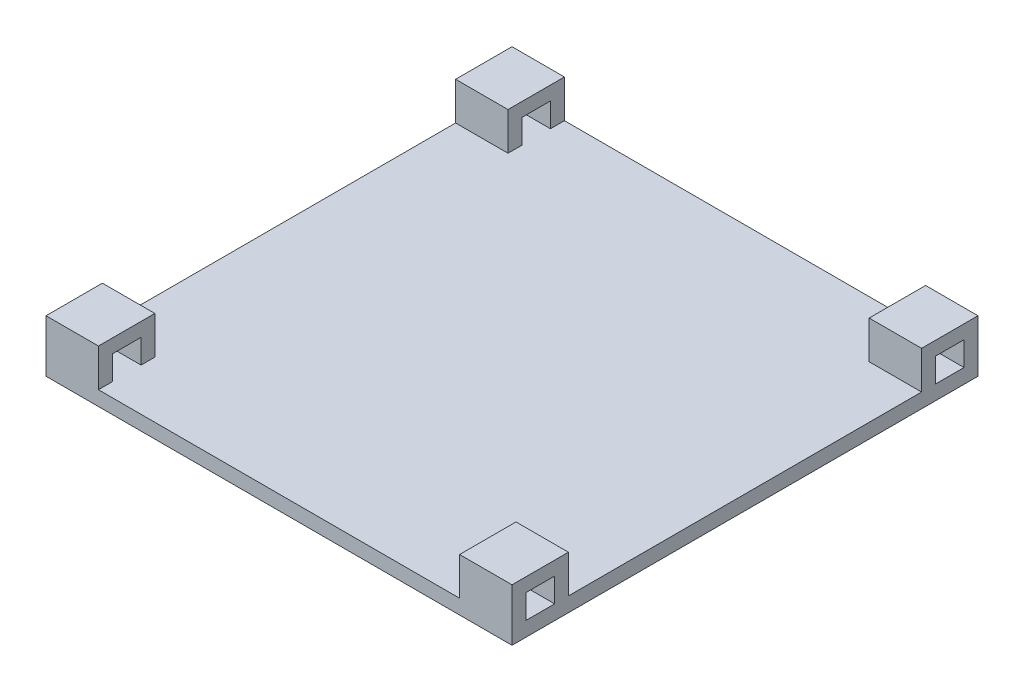
ISO-10303-21;
HEADER;
FILE_DESCRIPTION(('STEP AP214'),'2;1');
FILE_NAME('part.step','',(''),(''),'','','');
FILE_SCHEMA(('AUTOMOTIVE_DESIGN { 1 0 10303 214 1 1 1 1 }'));
ENDSEC;
DATA;
#1=APPLICATION_CONTEXT('core data for automotive mechanical design processes');
#2=APPLICATION_PROTOCOL_DEFINITION('international standard','automotive_design',2000,#1);
#3=PRODUCT_CONTEXT('',#1,'mechanical');
#4=PRODUCT('Part','Part','',(#3));
#5=PRODUCT_RELATED_PRODUCT_CATEGORY('part','',(#4));
#6=PRODUCT_DEFINITION_FORMATION('','',#4);
#7=PRODUCT_DEFINITION_CONTEXT('part definition',#1,'design');
#8=PRODUCT_DEFINITION('design','',#6,#7);
#9=PRODUCT_DEFINITION_SHAPE('','',#8);
#10=(LENGTH_UNIT() NAMED_UNIT(*) SI_UNIT(.MILLI.,.METRE.));
#11=(NAMED_UNIT(*) PLANE_ANGLE_UNIT() SI_UNIT($,.RADIAN.));
#12=(NAMED_UNIT(*) SI_UNIT($,.STERADIAN.) SOLID_ANGLE_UNIT());
#13=UNCERTAINTY_MEASURE_WITH_UNIT(LENGTH_MEASURE(1.E-05),#10,'distance_accuracy_value','');
#14=(GEOMETRIC_REPRESENTATION_CONTEXT(3) GLOBAL_UNCERTAINTY_ASSIGNED_CONTEXT((#13)) GLOBAL_UNIT_ASSIGNED_CONTEXT((#10,
#11,#12)) REPRESENTATION_CONTEXT('',''));
#15=CARTESIAN_POINT('',(0.,0.,0.));
#16=DIRECTION('',(0.,0.,1.));
#17=DIRECTION('',(1.,0.,0.));
#18=AXIS2_PLACEMENT_3D('',#15,#16,#17);
#19=CARTESIAN_POINT('',(0.,6.35,0.));
#20=DIRECTION('',(0.,-1.,0.));
#21=DIRECTION('',(0.,0.,-1.));
#22=AXIS2_PLACEMENT_3D('',#19,#20,#21);
#23=PLANE('',#22);
#24=DIRECTION('',(0.,0.,-1.));
#25=VECTOR('',#24,1.);
#26=CARTESIAN_POINT('',(22.86,6.35,0.));
#27=LINE('',#26,#25);
#28=CARTESIAN_POINT('',(22.86,6.35,6.09600000000005));
#29=VERTEX_POINT('',#28);
#30=CARTESIAN_POINT('',(22.86,6.35,0.));
#31=VERTEX_POINT('',#30);
#32=EDGE_CURVE('E374',#29,#31,#27,.T.);
#33=ORIENTED_EDGE('',*,*,#32,.F.);
#34=DIRECTION('',(1.,0.,0.));
#35=VECTOR('',#34,1.);
#36=CARTESIAN_POINT('',(-16.336098922326,6.35,6.09600000000005));
#37=LINE('',#36,#35);
#38=CARTESIAN_POINT('',(0.,6.35,6.09600000000005));
#39=VERTEX_POINT('',#38);
#40=EDGE_CURVE('E316',#39,#29,#37,.T.);
#41=ORIENTED_EDGE('',*,*,#40,.F.);
#42=DIRECTION('',(0.,0.,1.));
#43=VECTOR('',#42,1.);
#44=CARTESIAN_POINT('',(0.,6.35,6.09600000000004));
#45=LINE('',#44,#43);
#46=CARTESIAN_POINT('',(0.,6.35,18.6040000000001));
#47=VERTEX_POINT('',#46);
#48=EDGE_CURVE('E292',#39,#47,#45,.T.);
#49=ORIENTED_EDGE('',*,*,#48,.T.);
#50=DIRECTION('',(1.,0.,0.));
#51=VECTOR('',#50,1.);
#52=CARTESIAN_POINT('',(-16.3360989223259,6.35,18.6040000000001));
#53=LINE('',#52,#51);
#54=CARTESIAN_POINT('',(22.86,6.35,18.6040000000001));
#55=VERTEX_POINT('',#54);
#56=EDGE_CURVE('E290',#47,#55,#53,.T.);
#57=ORIENTED_EDGE('',*,*,#56,.T.);
#58=CARTESIAN_POINT('',(22.86,6.35,24.6000000000001));
#59=VERTEX_POINT('',#58);
#60=EDGE_CURVE('E364',#59,#55,#27,.T.);
#61=ORIENTED_EDGE('',*,*,#60,.F.);
#62=DIRECTION('',(1.,0.,0.));
#63=VECTOR('',#62,1.);
#64=CARTESIAN_POINT('',(0.,6.35,24.6000000000001));
#65=LINE('',#64,#63);
#66=CARTESIAN_POINT('',(0.,6.35,24.6000000000001));
#67=VERTEX_POINT('',#66);
#68=EDGE_CURVE('E359',#67,#59,#65,.T.);
#69=ORIENTED_EDGE('',*,*,#68,.F.);
#70=DIRECTION('',(0.,0.,1.));
#71=VECTOR('',#70,1.);
#72=CARTESIAN_POINT('',(0.,6.35,0.));
#73=LINE('',#72,#71);
#74=CARTESIAN_POINT('',(0.,6.35,178.6));
#75=VERTEX_POINT('',#74);
#76=EDGE_CURVE('E441',#67,#75,#73,.T.);
#77=ORIENTED_EDGE('',*,*,#76,.T.);
#78=DIRECTION('',(-1.,0.,0.));
#79=VECTOR('',#78,1.);
#80=CARTESIAN_POINT('',(0.,6.35,178.6));
#81=LINE('',#80,#79);
#82=CARTESIAN_POINT('',(22.86,6.35,178.6));
#83=VERTEX_POINT('',#82);
#84=EDGE_CURVE('E390',#83,#75,#81,.T.);
#85=ORIENTED_EDGE('',*,*,#84,.F.);
#86=DIRECTION('',(0.,0.,-1.));
#87=VECTOR('',#86,1.);
#88=CARTESIAN_POINT('',(22.86,6.35,203.2));
#89=LINE('',#88,#87);
#90=CARTESIAN_POINT('',(22.86,6.35,184.596));
#91=VERTEX_POINT('',#90);
#92=EDGE_CURVE('E385',#91,#83,#89,.T.);
#93=ORIENTED_EDGE('',*,*,#92,.F.);
#94=DIRECTION('',(1.,0.,0.));
#95=VECTOR('',#94,1.);
#96=CARTESIAN_POINT('',(-16.3360989223254,6.35,184.596));
#97=LINE('',#96,#95);
#98=CARTESIAN_POINT('',(0.,6.35,184.596));
#99=VERTEX_POINT('',#98);
#100=EDGE_CURVE('E253',#99,#91,#97,.T.);
#101=ORIENTED_EDGE('',*,*,#100,.F.);
#102=DIRECTION('',(0.,0.,1.));
#103=VECTOR('',#102,1.);
#104=CARTESIAN_POINT('',(0.,6.35,197.104));
#105=LINE('',#104,#103);
#106=CARTESIAN_POINT('',(0.,6.35,197.104));
#107=VERTEX_POINT('',#106);
#108=EDGE_CURVE('E286',#99,#107,#105,.T.);
#109=ORIENTED_EDGE('',*,*,#108,.T.);
#110=DIRECTION('',(1.,0.,0.));
#111=VECTOR('',#110,1.);
#112=CARTESIAN_POINT('',(-16.3360989223254,6.35,197.104));
#113=LINE('',#112,#111);
#114=CARTESIAN_POINT('',(22.86,6.35,197.104));
#115=VERTEX_POINT('',#114);
#116=EDGE_CURVE('E273',#107,#115,#113,.T.);
#117=ORIENTED_EDGE('',*,*,#116,.T.);
#118=CARTESIAN_POINT('',(22.86,6.35,203.2));
#119=VERTEX_POINT('',#118);
#120=EDGE_CURVE('E398',#119,#115,#89,.T.);
#121=ORIENTED_EDGE('',*,*,#120,.F.);
#122=DIRECTION('',(1.,0.,0.));
#123=VECTOR('',#122,1.);
#124=CARTESIAN_POINT('',(0.,6.35,203.2));
#125=LINE('',#124,#123);
#126=CARTESIAN_POINT('',(180.34,6.35,203.2));
#127=VERTEX_POINT('',#126);
#128=EDGE_CURVE('E444',#119,#127,#125,.T.);
#129=ORIENTED_EDGE('',*,*,#128,.T.);
#130=DIRECTION('',(0.,0.,1.));
#131=VECTOR('',#130,1.);
#132=CARTESIAN_POINT('',(180.34,6.35,203.2));
#133=LINE('',#132,#131);
#134=CARTESIAN_POINT('',(180.34,6.35,197.104));
#135=VERTEX_POINT('',#134);
#136=EDGE_CURVE('E426',#135,#127,#133,.T.);
#137=ORIENTED_EDGE('',*,*,#136,.F.);
#138=CARTESIAN_POINT('',(203.2,6.35,197.104));
#139=VERTEX_POINT('',#138);
#140=EDGE_CURVE('E277',#135,#139,#113,.T.);
#141=ORIENTED_EDGE('',*,*,#140,.T.);
#142=DIRECTION('',(0.,0.,-1.));
#143=VECTOR('',#142,1.);
#144=CARTESIAN_POINT('',(203.2,6.35,197.104));
#145=LINE('',#144,#143);
#146=CARTESIAN_POINT('',(203.2,6.35,184.596));
#147=VERTEX_POINT('',#146);
#148=EDGE_CURVE('E263',#139,#147,#145,.T.);
#149=ORIENTED_EDGE('',*,*,#148,.T.);
#150=CARTESIAN_POINT('',(180.34,6.35,184.596));
#151=VERTEX_POINT('',#150);
#152=EDGE_CURVE('E260',#151,#147,#97,.T.);
#153=ORIENTED_EDGE('',*,*,#152,.F.);
#154=CARTESIAN_POINT('',(180.34,6.35,178.6));
#155=VERTEX_POINT('',#154);
#156=EDGE_CURVE('E416',#155,#151,#133,.T.);
#157=ORIENTED_EDGE('',*,*,#156,.F.);
#158=DIRECTION('',(-1.,0.,0.));
#159=VECTOR('',#158,1.);
#160=CARTESIAN_POINT('',(203.2,6.35,178.6));
#161=LINE('',#160,#159);
#162=CARTESIAN_POINT('',(203.2,6.35,178.6));
#163=VERTEX_POINT('',#162);
#164=EDGE_CURVE('E411',#163,#155,#161,.T.);
#165=ORIENTED_EDGE('',*,*,#164,.F.);
#166=DIRECTION('',(0.,0.,-1.));
#167=VECTOR('',#166,1.);
#168=CARTESIAN_POINT('',(203.2,6.35,0.));
#169=LINE('',#168,#167);
#170=CARTESIAN_POINT('',(203.2,6.35,24.6));
#171=VERTEX_POINT('',#170);
#172=EDGE_CURVE('E447',#163,#171,#169,.T.);
#173=ORIENTED_EDGE('',*,*,#172,.T.);
#174=DIRECTION('',(1.,0.,0.));
#175=VECTOR('',#174,1.);
#176=CARTESIAN_POINT('',(203.2,6.35,24.6));
#177=LINE('',#176,#175);
#178=CARTESIAN_POINT('',(180.34,6.35,24.6));
#179=VERTEX_POINT('',#178);
#180=EDGE_CURVE('E338',#179,#171,#177,.T.);
#181=ORIENTED_EDGE('',*,*,#180,.F.);
#182=DIRECTION('',(0.,0.,1.));
#183=VECTOR('',#182,1.);
#184=CARTESIAN_POINT('',(180.34,6.35,0.));
#185=LINE('',#184,#183);
#186=CARTESIAN_POINT('',(180.34,6.35,18.6040000000001));
#187=VERTEX_POINT('',#186);
#188=EDGE_CURVE('E333',#187,#179,#185,.T.);
#189=ORIENTED_EDGE('',*,*,#188,.F.);
#190=CARTESIAN_POINT('',(203.199999999999,6.35,18.6040000000001));
#191=VERTEX_POINT('',#190);
#192=EDGE_CURVE('E309',#187,#191,#53,.T.);
#193=ORIENTED_EDGE('',*,*,#192,.T.);
#194=DIRECTION('',(0.,0.,-1.));
#195=VECTOR('',#194,1.);
#196=CARTESIAN_POINT('',(203.199999999999,6.35,6.09600000000005));
#197=LINE('',#196,#195);
#198=CARTESIAN_POINT('',(203.2,6.35,6.09600000000005));
#199=VERTEX_POINT('',#198);
#200=EDGE_CURVE('E295',#191,#199,#197,.T.);
#201=ORIENTED_EDGE('',*,*,#200,.T.);
#202=CARTESIAN_POINT('',(180.34,6.35,6.09600000000005));
#203=VERTEX_POINT('',#202);
#204=EDGE_CURVE('E306',#203,#199,#37,.T.);
#205=ORIENTED_EDGE('',*,*,#204,.F.);
#206=CARTESIAN_POINT('',(180.34,6.35,0.));
#207=VERTEX_POINT('',#206);
#208=EDGE_CURVE('E346',#207,#203,#185,.T.);
#209=ORIENTED_EDGE('',*,*,#208,.F.);
#210=DIRECTION('',(-1.,0.,0.));
#211=VECTOR('',#210,1.);
#212=CARTESIAN_POINT('',(0.,6.35,0.));
#213=LINE('',#212,#211);
#214=EDGE_CURVE('E438',#207,#31,#213,.T.);
#215=ORIENTED_EDGE('',*,*,#214,.T.);
#216=EDGE_LOOP('',(#33,#41,#49,#57,#61,#69,#77,#85,#93,#101,#109,#117,#121,#129,#137,#141,#149,
#153,#157,#165,#173,#181,#189,#193,#201,#205,#209,#215));
#217=FACE_BOUND('',#216,.T.);
#218=ADVANCED_FACE('F33',(#217),#23,.F.);
#219=CARTESIAN_POINT('',(0.,6.35,0.));
#220=DIRECTION('',(0.,0.,1.));
#221=DIRECTION('',(1.,0.,0.));
#222=AXIS2_PLACEMENT_3D('',#219,#220,#221);
#223=PLANE('',#222);
#224=DIRECTION('',(-1.,0.,0.));
#225=VECTOR('',#224,1.);
#226=CARTESIAN_POINT('',(0.,0.,0.));
#227=LINE('',#226,#225);
#228=CARTESIAN_POINT('',(203.2,0.,0.));
#229=VERTEX_POINT('',#228);
#230=CARTESIAN_POINT('',(0.,0.,0.));
#231=VERTEX_POINT('',#230);
#232=EDGE_CURVE('E437',#229,#231,#227,.T.);
#233=ORIENTED_EDGE('',*,*,#232,.T.);
#234=DIRECTION('',(0.,-1.,0.));
#235=VECTOR('',#234,1.);
#236=CARTESIAN_POINT('',(0.,6.35,0.));
#237=LINE('',#236,#235);
#238=CARTESIAN_POINT('',(0.,22.86,0.));
#239=VERTEX_POINT('',#238);
#240=EDGE_CURVE('E465',#239,#231,#237,.T.);
#241=ORIENTED_EDGE('',*,*,#240,.F.);
#242=DIRECTION('',(-1.,0.,0.));
#243=VECTOR('',#242,1.);
#244=CARTESIAN_POINT('',(0.,22.86,0.));
#245=LINE('',#244,#243);
#246=CARTESIAN_POINT('',(22.86,22.86,0.));
#247=VERTEX_POINT('',#246);
#248=EDGE_CURVE('E368',#247,#239,#245,.T.);
#249=ORIENTED_EDGE('',*,*,#248,.F.);
#250=DIRECTION('',(0.,-1.,0.));
#251=VECTOR('',#250,1.);
#252=CARTESIAN_POINT('',(22.86,22.86,0.));
#253=LINE('',#252,#251);
#254=EDGE_CURVE('E371',#247,#31,#253,.T.);
#255=ORIENTED_EDGE('',*,*,#254,.T.);
#256=ORIENTED_EDGE('',*,*,#214,.F.);
#257=DIRECTION('',(0.,-1.,0.));
#258=VECTOR('',#257,1.);
#259=CARTESIAN_POINT('',(180.34,22.86,0.));
#260=LINE('',#259,#258);
#261=CARTESIAN_POINT('',(180.34,22.86,0.));
#262=VERTEX_POINT('',#261);
#263=EDGE_CURVE('E356',#262,#207,#260,.T.);
#264=ORIENTED_EDGE('',*,*,#263,.F.);
#265=DIRECTION('',(-1.,0.,0.));
#266=VECTOR('',#265,1.);
#267=CARTESIAN_POINT('',(203.2,22.86,0.));
#268=LINE('',#267,#266);
#269=CARTESIAN_POINT('',(203.2,22.86,0.));
#270=VERTEX_POINT('',#269);
#271=EDGE_CURVE('E334',#270,#262,#268,.T.);
#272=ORIENTED_EDGE('',*,*,#271,.F.);
#273=DIRECTION('',(0.,-1.,0.));
#274=VECTOR('',#273,1.);
#275=CARTESIAN_POINT('',(203.2,6.35,0.));
#276=LINE('',#275,#274);
#277=EDGE_CURVE('E449',#270,#229,#276,.T.);
#278=ORIENTED_EDGE('',*,*,#277,.T.);
#279=EDGE_LOOP('',(#233,#241,#249,#255,#256,#264,#272,#278));
#280=FACE_BOUND('',#279,.T.);
#281=ADVANCED_FACE('F35',(#280),#223,.F.);
#282=CARTESIAN_POINT('',(0.,6.35,0.));
#283=DIRECTION('',(1.,0.,0.));
#284=DIRECTION('',(0.,0.,-1.));
#285=AXIS2_PLACEMENT_3D('',#282,#283,#284);
#286=PLANE('',#285);
#287=DIRECTION('',(0.,1.,0.));
#288=VECTOR('',#287,1.);
#289=CARTESIAN_POINT('',(0.,6.35,197.104));
#290=LINE('',#289,#288);
#291=CARTESIAN_POINT('',(0.,16.858,197.104));
#292=VERTEX_POINT('',#291);
#293=EDGE_CURVE('E491',#107,#292,#290,.T.);
#294=ORIENTED_EDGE('',*,*,#293,.F.);
#295=ORIENTED_EDGE('',*,*,#108,.F.);
#296=DIRECTION('',(0.,-1.,0.));
#297=VECTOR('',#296,1.);
#298=CARTESIAN_POINT('',(0.,6.35,184.596));
#299=LINE('',#298,#297);
#300=CARTESIAN_POINT('',(0.,16.858,184.596));
#301=VERTEX_POINT('',#300);
#302=EDGE_CURVE('E283',#301,#99,#299,.T.);
#303=ORIENTED_EDGE('',*,*,#302,.F.);
#304=DIRECTION('',(0.,0.,-1.));
#305=VECTOR('',#304,1.);
#306=CARTESIAN_POINT('',(0.,16.858,184.596));
#307=LINE('',#306,#305);
#308=EDGE_CURVE('E276',#292,#301,#307,.T.);
#309=ORIENTED_EDGE('',*,*,#308,.F.);
#310=EDGE_LOOP('',(#294,#295,#303,#309));
#311=FACE_BOUND('',#310,.T.);
#312=DIRECTION('',(0.,1.,0.));
#313=VECTOR('',#312,1.);
#314=CARTESIAN_POINT('',(0.,6.35,18.6040000000001));
#315=LINE('',#314,#313);
#316=CARTESIAN_POINT('',(0.,16.858,18.6040000000001));
#317=VERTEX_POINT('',#316);
#318=EDGE_CURVE('E289',#47,#317,#315,.T.);
#319=ORIENTED_EDGE('',*,*,#318,.F.);
#320=ORIENTED_EDGE('',*,*,#48,.F.);
#321=DIRECTION('',(0.,-1.,0.));
#322=VECTOR('',#321,1.);
#323=CARTESIAN_POINT('',(0.,6.35,6.09600000000005));
#324=LINE('',#323,#322);
#325=CARTESIAN_POINT('',(0.,16.858,6.09600000000005));
#326=VERTEX_POINT('',#325);
#327=EDGE_CURVE('E294',#326,#39,#324,.T.);
#328=ORIENTED_EDGE('',*,*,#327,.F.);
#329=DIRECTION('',(0.,0.,-1.));
#330=VECTOR('',#329,1.);
#331=CARTESIAN_POINT('',(0.,16.858,18.6040000000001));
#332=LINE('',#331,#330);
#333=EDGE_CURVE('E287',#317,#326,#332,.T.);
#334=ORIENTED_EDGE('',*,*,#333,.F.);
#335=EDGE_LOOP('',(#319,#320,#328,#334));
#336=FACE_BOUND('',#335,.T.);
#337=DIRECTION('',(0.,0.,1.));
#338=VECTOR('',#337,1.);
#339=CARTESIAN_POINT('',(0.,0.,0.));
#340=LINE('',#339,#338);
#341=CARTESIAN_POINT('',(0.,0.,203.2));
#342=VERTEX_POINT('',#341);
#343=EDGE_CURVE('E452',#231,#342,#340,.T.);
#344=ORIENTED_EDGE('',*,*,#343,.T.);
#345=DIRECTION('',(0.,-1.,0.));
#346=VECTOR('',#345,1.);
#347=CARTESIAN_POINT('',(0.,6.35,203.2));
#348=LINE('',#347,#346);
#349=CARTESIAN_POINT('',(0.,22.86,203.2));
#350=VERTEX_POINT('',#349);
#351=EDGE_CURVE('E462',#350,#342,#348,.T.);
#352=ORIENTED_EDGE('',*,*,#351,.F.);
#353=DIRECTION('',(0.,0.,1.));
#354=VECTOR('',#353,1.);
#355=CARTESIAN_POINT('',(0.,22.86,203.2));
#356=LINE('',#355,#354);
#357=CARTESIAN_POINT('',(0.,22.86,178.6));
#358=VERTEX_POINT('',#357);
#359=EDGE_CURVE('E394',#358,#350,#356,.T.);
#360=ORIENTED_EDGE('',*,*,#359,.F.);
#361=DIRECTION('',(0.,-1.,0.));
#362=VECTOR('',#361,1.);
#363=CARTESIAN_POINT('',(0.,22.86,178.6));
#364=LINE('',#363,#362);
#365=EDGE_CURVE('E397',#358,#75,#364,.T.);
#366=ORIENTED_EDGE('',*,*,#365,.T.);
#367=ORIENTED_EDGE('',*,*,#76,.F.);
#368=DIRECTION('',(0.,-1.,0.));
#369=VECTOR('',#368,1.);
#370=CARTESIAN_POINT('',(0.,22.86,24.6000000000001));
#371=LINE('',#370,#369);
#372=CARTESIAN_POINT('',(0.,22.86,24.6000000000001));
#373=VERTEX_POINT('',#372);
#374=EDGE_CURVE('E382',#373,#67,#371,.T.);
#375=ORIENTED_EDGE('',*,*,#374,.F.);
#376=DIRECTION('',(0.,0.,1.));
#377=VECTOR('',#376,1.);
#378=CARTESIAN_POINT('',(0.,22.86,0.));
#379=LINE('',#378,#377);
#380=EDGE_CURVE('E360',#239,#373,#379,.T.);
#381=ORIENTED_EDGE('',*,*,#380,.F.);
#382=ORIENTED_EDGE('',*,*,#240,.T.);
#383=EDGE_LOOP('',(#344,#352,#360,#366,#367,#375,#381,#382));
#384=FACE_BOUND('',#383,.T.);
#385=ADVANCED_FACE('F553',(#311,#336,#384),#286,.F.);
#386=CARTESIAN_POINT('',(0.,6.35,203.2));
#387=DIRECTION('',(0.,0.,-1.));
#388=DIRECTION('',(-1.,0.,0.));
#389=AXIS2_PLACEMENT_3D('',#386,#387,#388);
#390=PLANE('',#389);
#391=DIRECTION('',(1.,0.,0.));
#392=VECTOR('',#391,1.);
#393=CARTESIAN_POINT('',(0.,0.,203.2));
#394=LINE('',#393,#392);
#395=CARTESIAN_POINT('',(203.2,0.,203.2));
#396=VERTEX_POINT('',#395);
#397=EDGE_CURVE('E454',#342,#396,#394,.T.);
#398=ORIENTED_EDGE('',*,*,#397,.T.);
#399=DIRECTION('',(0.,-1.,0.));
#400=VECTOR('',#399,1.);
#401=CARTESIAN_POINT('',(203.2,6.35,203.2));
#402=LINE('',#401,#400);
#403=CARTESIAN_POINT('',(203.2,22.86,203.2));
#404=VERTEX_POINT('',#403);
#405=EDGE_CURVE('E459',#404,#396,#402,.T.);
#406=ORIENTED_EDGE('',*,*,#405,.F.);
#407=DIRECTION('',(1.,0.,0.));
#408=VECTOR('',#407,1.);
#409=CARTESIAN_POINT('',(203.2,22.86,203.2));
#410=LINE('',#409,#408);
#411=CARTESIAN_POINT('',(180.34,22.86,203.2));
#412=VERTEX_POINT('',#411);
#413=EDGE_CURVE('E420',#412,#404,#410,.T.);
#414=ORIENTED_EDGE('',*,*,#413,.F.);
#415=DIRECTION('',(0.,-1.,0.));
#416=VECTOR('',#415,1.);
#417=CARTESIAN_POINT('',(180.34,22.86,203.2));
#418=LINE('',#417,#416);
#419=EDGE_CURVE('E423',#412,#127,#418,.T.);
#420=ORIENTED_EDGE('',*,*,#419,.T.);
#421=ORIENTED_EDGE('',*,*,#128,.F.);
#422=DIRECTION('',(0.,-1.,0.));
#423=VECTOR('',#422,1.);
#424=CARTESIAN_POINT('',(22.86,22.86,203.2));
#425=LINE('',#424,#423);
#426=CARTESIAN_POINT('',(22.86,22.86,203.2));
#427=VERTEX_POINT('',#426);
#428=EDGE_CURVE('E408',#427,#119,#425,.T.);
#429=ORIENTED_EDGE('',*,*,#428,.F.);
#430=DIRECTION('',(1.,0.,0.));
#431=VECTOR('',#430,1.);
#432=CARTESIAN_POINT('',(0.,22.86,203.2));
#433=LINE('',#432,#431);
#434=EDGE_CURVE('E386',#350,#427,#433,.T.);
#435=ORIENTED_EDGE('',*,*,#434,.F.);
#436=ORIENTED_EDGE('',*,*,#351,.T.);
#437=EDGE_LOOP('',(#398,#406,#414,#420,#421,#429,#435,#436));
#438=FACE_BOUND('',#437,.T.);
#439=ADVANCED_FACE('F598',(#438),#390,.F.);
#440=CARTESIAN_POINT('',(203.2,6.35,0.));
#441=DIRECTION('',(-1.,0.,0.));
#442=DIRECTION('',(0.,0.,1.));
#443=AXIS2_PLACEMENT_3D('',#440,#441,#442);
#444=PLANE('',#443);
#445=DIRECTION('',(0.,1.,0.));
#446=VECTOR('',#445,1.);
#447=CARTESIAN_POINT('',(203.2,6.35,184.596));
#448=LINE('',#447,#446);
#449=CARTESIAN_POINT('',(203.2,16.858,184.596));
#450=VERTEX_POINT('',#449);
#451=EDGE_CURVE('E257',#147,#450,#448,.T.);
#452=ORIENTED_EDGE('',*,*,#451,.F.);
#453=ORIENTED_EDGE('',*,*,#148,.F.);
#454=DIRECTION('',(0.,-1.,0.));
#455=VECTOR('',#454,1.);
#456=CARTESIAN_POINT('',(203.2,6.35,197.104));
#457=LINE('',#456,#455);
#458=CARTESIAN_POINT('',(203.2,16.858,197.104));
#459=VERTEX_POINT('',#458);
#460=EDGE_CURVE('E268',#459,#139,#457,.T.);
#461=ORIENTED_EDGE('',*,*,#460,.F.);
#462=DIRECTION('',(0.,0.,1.));
#463=VECTOR('',#462,1.);
#464=CARTESIAN_POINT('',(203.2,16.858,184.596));
#465=LINE('',#464,#463);
#466=EDGE_CURVE('E247',#450,#459,#465,.T.);
#467=ORIENTED_EDGE('',*,*,#466,.F.);
#468=EDGE_LOOP('',(#452,#453,#461,#467));
#469=FACE_BOUND('',#468,.T.);
#470=DIRECTION('',(0.,1.,0.));
#471=VECTOR('',#470,1.);
#472=CARTESIAN_POINT('',(203.199999999999,6.35,6.09600000000005));
#473=LINE('',#472,#471);
#474=CARTESIAN_POINT('',(203.199999999999,16.858,6.09600000000005));
#475=VERTEX_POINT('',#474);
#476=EDGE_CURVE('E297',#199,#475,#473,.T.);
#477=ORIENTED_EDGE('',*,*,#476,.F.);
#478=ORIENTED_EDGE('',*,*,#200,.F.);
#479=DIRECTION('',(0.,-1.,0.));
#480=VECTOR('',#479,1.);
#481=CARTESIAN_POINT('',(203.199999999999,6.35,18.6040000000001));
#482=LINE('',#481,#480);
#483=CARTESIAN_POINT('',(203.199999999999,16.858,18.6040000000001));
#484=VERTEX_POINT('',#483);
#485=EDGE_CURVE('E303',#484,#191,#482,.T.);
#486=ORIENTED_EDGE('',*,*,#485,.F.);
#487=DIRECTION('',(0.,0.,1.));
#488=VECTOR('',#487,1.);
#489=CARTESIAN_POINT('',(203.199999999999,16.858,18.6040000000001));
#490=LINE('',#489,#488);
#491=EDGE_CURVE('E300',#475,#484,#490,.T.);
#492=ORIENTED_EDGE('',*,*,#491,.F.);
#493=EDGE_LOOP('',(#477,#478,#486,#492));
#494=FACE_BOUND('',#493,.T.);
#495=DIRECTION('',(0.,0.,-1.));
#496=VECTOR('',#495,1.);
#497=CARTESIAN_POINT('',(203.2,0.,0.));
#498=LINE('',#497,#496);
#499=EDGE_CURVE('E442',#396,#229,#498,.T.);
#500=ORIENTED_EDGE('',*,*,#499,.T.);
#501=ORIENTED_EDGE('',*,*,#277,.F.);
#502=DIRECTION('',(0.,0.,-1.));
#503=VECTOR('',#502,1.);
#504=CARTESIAN_POINT('',(203.2,22.86,0.));
#505=LINE('',#504,#503);
#506=CARTESIAN_POINT('',(203.2,22.86,24.6));
#507=VERTEX_POINT('',#506);
#508=EDGE_CURVE('E342',#507,#270,#505,.T.);
#509=ORIENTED_EDGE('',*,*,#508,.F.);
#510=DIRECTION('',(0.,-1.,0.));
#511=VECTOR('',#510,1.);
#512=CARTESIAN_POINT('',(203.2,22.86,24.6));
#513=LINE('',#512,#511);
#514=EDGE_CURVE('E345',#507,#171,#513,.T.);
#515=ORIENTED_EDGE('',*,*,#514,.T.);
#516=ORIENTED_EDGE('',*,*,#172,.F.);
#517=DIRECTION('',(0.,-1.,0.));
#518=VECTOR('',#517,1.);
#519=CARTESIAN_POINT('',(203.2,22.86,178.6));
#520=LINE('',#519,#518);
#521=CARTESIAN_POINT('',(203.2,22.86,178.6));
#522=VERTEX_POINT('',#521);
#523=EDGE_CURVE('E434',#522,#163,#520,.T.);
#524=ORIENTED_EDGE('',*,*,#523,.F.);
#525=DIRECTION('',(0.,0.,-1.));
#526=VECTOR('',#525,1.);
#527=CARTESIAN_POINT('',(203.2,22.86,203.2));
#528=LINE('',#527,#526);
#529=EDGE_CURVE('E412',#404,#522,#528,.T.);
#530=ORIENTED_EDGE('',*,*,#529,.F.);
#531=ORIENTED_EDGE('',*,*,#405,.T.);
#532=EDGE_LOOP('',(#500,#501,#509,#515,#516,#524,#530,#531));
#533=FACE_BOUND('',#532,.T.);
#534=ADVANCED_FACE('F265',(#469,#494,#533),#444,.F.);
#535=CARTESIAN_POINT('',(0.,0.,0.));
#536=DIRECTION('',(0.,-1.,0.));
#537=DIRECTION('',(0.,0.,-1.));
#538=AXIS2_PLACEMENT_3D('',#535,#536,#537);
#539=PLANE('',#538);
#540=ORIENTED_EDGE('',*,*,#232,.F.);
#541=ORIENTED_EDGE('',*,*,#499,.F.);
#542=ORIENTED_EDGE('',*,*,#397,.F.);
#543=ORIENTED_EDGE('',*,*,#343,.F.);
#544=EDGE_LOOP('',(#540,#541,#542,#543));
#545=FACE_BOUND('',#544,.T.);
#546=ADVANCED_FACE('F593',(#545),#539,.T.);
#547=CARTESIAN_POINT('',(203.2,22.86,178.6));
#548=DIRECTION('',(0.,0.,1.));
#549=DIRECTION('',(1.,0.,0.));
#550=AXIS2_PLACEMENT_3D('',#547,#548,#549);
#551=PLANE('',#550);
#552=ORIENTED_EDGE('',*,*,#164,.T.);
#553=DIRECTION('',(0.,-1.,0.));
#554=VECTOR('',#553,1.);
#555=CARTESIAN_POINT('',(180.34,22.86,178.6));
#556=LINE('',#555,#554);
#557=CARTESIAN_POINT('',(180.34,22.86,178.6));
#558=VERTEX_POINT('',#557);
#559=EDGE_CURVE('E431',#558,#155,#556,.T.);
#560=ORIENTED_EDGE('',*,*,#559,.F.);
#561=DIRECTION('',(-1.,0.,0.));
#562=VECTOR('',#561,1.);
#563=CARTESIAN_POINT('',(203.2,22.86,178.6));
#564=LINE('',#563,#562);
#565=EDGE_CURVE('E415',#522,#558,#564,.T.);
#566=ORIENTED_EDGE('',*,*,#565,.F.);
#567=ORIENTED_EDGE('',*,*,#523,.T.);
#568=EDGE_LOOP('',(#552,#560,#566,#567));
#569=FACE_BOUND('',#568,.T.);
#570=ADVANCED_FACE('F508',(#569),#551,.F.);
#571=CARTESIAN_POINT('',(180.34,22.86,203.2));
#572=DIRECTION('',(1.,0.,0.));
#573=DIRECTION('',(0.,0.,-1.));
#574=AXIS2_PLACEMENT_3D('',#571,#572,#573);
#575=PLANE('',#574);
#576=DIRECTION('',(0.,0.,1.));
#577=VECTOR('',#576,1.);
#578=CARTESIAN_POINT('',(180.34,16.858,203.2));
#579=LINE('',#578,#577);
#580=CARTESIAN_POINT('',(180.34,16.858,184.596));
#581=VERTEX_POINT('',#580);
#582=CARTESIAN_POINT('',(180.34,16.858,197.104));
#583=VERTEX_POINT('',#582);
#584=EDGE_CURVE('E250',#581,#583,#579,.T.);
#585=ORIENTED_EDGE('',*,*,#584,.T.);
#586=DIRECTION('',(0.,-1.,0.));
#587=VECTOR('',#586,1.);
#588=CARTESIAN_POINT('',(180.34,22.86,197.104));
#589=LINE('',#588,#587);
#590=EDGE_CURVE('E330',#583,#135,#589,.T.);
#591=ORIENTED_EDGE('',*,*,#590,.T.);
#592=ORIENTED_EDGE('',*,*,#136,.T.);
#593=ORIENTED_EDGE('',*,*,#419,.F.);
#594=DIRECTION('',(0.,0.,1.));
#595=VECTOR('',#594,1.);
#596=CARTESIAN_POINT('',(180.34,22.86,203.2));
#597=LINE('',#596,#595);
#598=EDGE_CURVE('E418',#558,#412,#597,.T.);
#599=ORIENTED_EDGE('',*,*,#598,.F.);
#600=ORIENTED_EDGE('',*,*,#559,.T.);
#601=ORIENTED_EDGE('',*,*,#156,.T.);
#602=DIRECTION('',(0.,1.,0.));
#603=VECTOR('',#602,1.);
#604=CARTESIAN_POINT('',(180.34,22.86,184.596));
#605=LINE('',#604,#603);
#606=EDGE_CURVE('E327',#151,#581,#605,.T.);
#607=ORIENTED_EDGE('',*,*,#606,.T.);
#608=EDGE_LOOP('',(#585,#591,#592,#593,#599,#600,#601,#607));
#609=FACE_BOUND('',#608,.T.);
#610=ADVANCED_FACE('F503',(#609),#575,.F.);
#611=CARTESIAN_POINT('',(0.,22.86,0.));
#612=DIRECTION('',(0.,1.,0.));
#613=DIRECTION('',(0.,0.,1.));
#614=AXIS2_PLACEMENT_3D('',#611,#612,#613);
#615=PLANE('',#614);
#616=ORIENTED_EDGE('',*,*,#529,.T.);
#617=ORIENTED_EDGE('',*,*,#565,.T.);
#618=ORIENTED_EDGE('',*,*,#598,.T.);
#619=ORIENTED_EDGE('',*,*,#413,.T.);
#620=EDGE_LOOP('',(#616,#617,#618,#619));
#621=FACE_BOUND('',#620,.T.);
#622=ADVANCED_FACE('F626',(#621),#615,.T.);
#623=CARTESIAN_POINT('',(22.86,22.86,203.2));
#624=DIRECTION('',(-1.,0.,0.));
#625=DIRECTION('',(0.,0.,1.));
#626=AXIS2_PLACEMENT_3D('',#623,#624,#625);
#627=PLANE('',#626);
#628=ORIENTED_EDGE('',*,*,#120,.T.);
#629=DIRECTION('',(0.,1.,0.));
#630=VECTOR('',#629,1.);
#631=CARTESIAN_POINT('',(22.86,22.86,197.104));
#632=LINE('',#631,#630);
#633=CARTESIAN_POINT('',(22.86,16.858,197.104));
#634=VERTEX_POINT('',#633);
#635=EDGE_CURVE('E11',#115,#634,#632,.T.);
#636=ORIENTED_EDGE('',*,*,#635,.T.);
#637=DIRECTION('',(0.,0.,-1.));
#638=VECTOR('',#637,1.);
#639=CARTESIAN_POINT('',(22.86,16.858,203.2));
#640=LINE('',#639,#638);
#641=CARTESIAN_POINT('',(22.86,16.858,184.596));
#642=VERTEX_POINT('',#641);
#643=EDGE_CURVE('E41',#634,#642,#640,.T.);
#644=ORIENTED_EDGE('',*,*,#643,.T.);
#645=DIRECTION('',(0.,-1.,0.));
#646=VECTOR('',#645,1.);
#647=CARTESIAN_POINT('',(22.86,22.86,184.596));
#648=LINE('',#647,#646);
#649=EDGE_CURVE('E477',#642,#91,#648,.T.);
#650=ORIENTED_EDGE('',*,*,#649,.T.);
#651=ORIENTED_EDGE('',*,*,#92,.T.);
#652=DIRECTION('',(0.,-1.,0.));
#653=VECTOR('',#652,1.);
#654=CARTESIAN_POINT('',(22.86,22.86,178.6));
#655=LINE('',#654,#653);
#656=CARTESIAN_POINT('',(22.86,22.86,178.6));
#657=VERTEX_POINT('',#656);
#658=EDGE_CURVE('E405',#657,#83,#655,.T.);
#659=ORIENTED_EDGE('',*,*,#658,.F.);
#660=DIRECTION('',(0.,0.,-1.));
#661=VECTOR('',#660,1.);
#662=CARTESIAN_POINT('',(22.86,22.86,203.2));
#663=LINE('',#662,#661);
#664=EDGE_CURVE('E389',#427,#657,#663,.T.);
#665=ORIENTED_EDGE('',*,*,#664,.F.);
#666=ORIENTED_EDGE('',*,*,#428,.T.);
#667=EDGE_LOOP('',(#628,#636,#644,#650,#651,#659,#665,#666));
#668=FACE_BOUND('',#667,.T.);
#669=ADVANCED_FACE('F481',(#668),#627,.F.);
#670=CARTESIAN_POINT('',(0.,22.86,178.6));
#671=DIRECTION('',(0.,0.,1.));
#672=DIRECTION('',(1.,0.,0.));
#673=AXIS2_PLACEMENT_3D('',#670,#671,#672);
#674=PLANE('',#673);
#675=ORIENTED_EDGE('',*,*,#84,.T.);
#676=ORIENTED_EDGE('',*,*,#365,.F.);
#677=DIRECTION('',(-1.,0.,0.));
#678=VECTOR('',#677,1.);
#679=CARTESIAN_POINT('',(0.,22.86,178.6));
#680=LINE('',#679,#678);
#681=EDGE_CURVE('E392',#657,#358,#680,.T.);
#682=ORIENTED_EDGE('',*,*,#681,.F.);
#683=ORIENTED_EDGE('',*,*,#658,.T.);
#684=EDGE_LOOP('',(#675,#676,#682,#683));
#685=FACE_BOUND('',#684,.T.);
#686=ADVANCED_FACE('F568',(#685),#674,.F.);
#687=CARTESIAN_POINT('',(0.,22.86,0.));
#688=DIRECTION('',(0.,1.,0.));
#689=DIRECTION('',(0.,0.,1.));
#690=AXIS2_PLACEMENT_3D('',#687,#688,#689);
#691=PLANE('',#690);
#692=ORIENTED_EDGE('',*,*,#434,.T.);
#693=ORIENTED_EDGE('',*,*,#664,.T.);
#694=ORIENTED_EDGE('',*,*,#681,.T.);
#695=ORIENTED_EDGE('',*,*,#359,.T.);
#696=EDGE_LOOP('',(#692,#693,#694,#695));
#697=FACE_BOUND('',#696,.T.);
#698=ADVANCED_FACE('F645',(#697),#691,.T.);
#699=CARTESIAN_POINT('',(0.,22.86,24.6000000000001));
#700=DIRECTION('',(0.,0.,-1.));
#701=DIRECTION('',(-1.,0.,0.));
#702=AXIS2_PLACEMENT_3D('',#699,#700,#701);
#703=PLANE('',#702);
#704=ORIENTED_EDGE('',*,*,#68,.T.);
#705=DIRECTION('',(0.,-1.,0.));
#706=VECTOR('',#705,1.);
#707=CARTESIAN_POINT('',(22.86,22.86,24.6000000000001));
#708=LINE('',#707,#706);
#709=CARTESIAN_POINT('',(22.86,22.86,24.6000000000001));
#710=VERTEX_POINT('',#709);
#711=EDGE_CURVE('E379',#710,#59,#708,.T.);
#712=ORIENTED_EDGE('',*,*,#711,.F.);
#713=DIRECTION('',(1.,0.,0.));
#714=VECTOR('',#713,1.);
#715=CARTESIAN_POINT('',(0.,22.86,24.6000000000001));
#716=LINE('',#715,#714);
#717=EDGE_CURVE('E363',#373,#710,#716,.T.);
#718=ORIENTED_EDGE('',*,*,#717,.F.);
#719=ORIENTED_EDGE('',*,*,#374,.T.);
#720=EDGE_LOOP('',(#704,#712,#718,#719));
#721=FACE_BOUND('',#720,.T.);
#722=ADVANCED_FACE('F561',(#721),#703,.F.);
#723=CARTESIAN_POINT('',(22.86,22.86,0.));
#724=DIRECTION('',(-1.,0.,0.));
#725=DIRECTION('',(0.,0.,1.));
#726=AXIS2_PLACEMENT_3D('',#723,#724,#725);
#727=PLANE('',#726);
#728=ORIENTED_EDGE('',*,*,#60,.T.);
#729=DIRECTION('',(0.,1.,0.));
#730=VECTOR('',#729,1.);
#731=CARTESIAN_POINT('',(22.86,22.86,18.6040000000001));
#732=LINE('',#731,#730);
#733=CARTESIAN_POINT('',(22.86,16.858,18.6040000000001));
#734=VERTEX_POINT('',#733);
#735=EDGE_CURVE('E324',#55,#734,#732,.T.);
#736=ORIENTED_EDGE('',*,*,#735,.T.);
#737=DIRECTION('',(0.,0.,-1.));
#738=VECTOR('',#737,1.);
#739=CARTESIAN_POINT('',(22.86,16.858,0.));
#740=LINE('',#739,#738);
#741=CARTESIAN_POINT('',(22.86,16.858,6.09600000000005));
#742=VERTEX_POINT('',#741);
#743=EDGE_CURVE('E321',#734,#742,#740,.T.);
#744=ORIENTED_EDGE('',*,*,#743,.T.);
#745=DIRECTION('',(0.,-1.,0.));
#746=VECTOR('',#745,1.);
#747=CARTESIAN_POINT('',(22.86,22.86,6.09600000000005));
#748=LINE('',#747,#746);
#749=EDGE_CURVE('E285',#742,#29,#748,.T.);
#750=ORIENTED_EDGE('',*,*,#749,.T.);
#751=ORIENTED_EDGE('',*,*,#32,.T.);
#752=ORIENTED_EDGE('',*,*,#254,.F.);
#753=DIRECTION('',(0.,0.,-1.));
#754=VECTOR('',#753,1.);
#755=CARTESIAN_POINT('',(22.86,22.86,0.));
#756=LINE('',#755,#754);
#757=EDGE_CURVE('E366',#710,#247,#756,.T.);
#758=ORIENTED_EDGE('',*,*,#757,.F.);
#759=ORIENTED_EDGE('',*,*,#711,.T.);
#760=EDGE_LOOP('',(#728,#736,#744,#750,#751,#752,#758,#759));
#761=FACE_BOUND('',#760,.T.);
#762=ADVANCED_FACE('F543',(#761),#727,.F.);
#763=CARTESIAN_POINT('',(0.,22.86,0.));
#764=DIRECTION('',(0.,1.,0.));
#765=DIRECTION('',(0.,0.,1.));
#766=AXIS2_PLACEMENT_3D('',#763,#764,#765);
#767=PLANE('',#766);
#768=ORIENTED_EDGE('',*,*,#380,.T.);
#769=ORIENTED_EDGE('',*,*,#717,.T.);
#770=ORIENTED_EDGE('',*,*,#757,.T.);
#771=ORIENTED_EDGE('',*,*,#248,.T.);
#772=EDGE_LOOP('',(#768,#769,#770,#771));
#773=FACE_BOUND('',#772,.T.);
#774=ADVANCED_FACE('F665',(#773),#767,.T.);
#775=CARTESIAN_POINT('',(180.34,22.86,0.));
#776=DIRECTION('',(1.,0.,0.));
#777=DIRECTION('',(0.,0.,-1.));
#778=AXIS2_PLACEMENT_3D('',#775,#776,#777);
#779=PLANE('',#778);
#780=DIRECTION('',(0.,0.,1.));
#781=VECTOR('',#780,1.);
#782=CARTESIAN_POINT('',(180.34,16.858,0.));
#783=LINE('',#782,#781);
#784=CARTESIAN_POINT('',(180.34,16.858,6.09600000000005));
#785=VERTEX_POINT('',#784);
#786=CARTESIAN_POINT('',(180.34,16.858,18.6040000000001));
#787=VERTEX_POINT('',#786);
#788=EDGE_CURVE('E471',#785,#787,#783,.T.);
#789=ORIENTED_EDGE('',*,*,#788,.T.);
#790=DIRECTION('',(0.,-1.,0.));
#791=VECTOR('',#790,1.);
#792=CARTESIAN_POINT('',(180.34,22.86,18.6040000000001));
#793=LINE('',#792,#791);
#794=EDGE_CURVE('E474',#787,#187,#793,.T.);
#795=ORIENTED_EDGE('',*,*,#794,.T.);
#796=ORIENTED_EDGE('',*,*,#188,.T.);
#797=DIRECTION('',(0.,-1.,0.));
#798=VECTOR('',#797,1.);
#799=CARTESIAN_POINT('',(180.34,22.86,24.6));
#800=LINE('',#799,#798);
#801=CARTESIAN_POINT('',(180.34,22.86,24.6));
#802=VERTEX_POINT('',#801);
#803=EDGE_CURVE('E353',#802,#179,#800,.T.);
#804=ORIENTED_EDGE('',*,*,#803,.F.);
#805=DIRECTION('',(0.,0.,1.));
#806=VECTOR('',#805,1.);
#807=CARTESIAN_POINT('',(180.34,22.86,0.));
#808=LINE('',#807,#806);
#809=EDGE_CURVE('E337',#262,#802,#808,.T.);
#810=ORIENTED_EDGE('',*,*,#809,.F.);
#811=ORIENTED_EDGE('',*,*,#263,.T.);
#812=ORIENTED_EDGE('',*,*,#208,.T.);
#813=DIRECTION('',(0.,1.,0.));
#814=VECTOR('',#813,1.);
#815=CARTESIAN_POINT('',(180.34,22.86,6.09600000000005));
#816=LINE('',#815,#814);
#817=EDGE_CURVE('E468',#203,#785,#816,.T.);
#818=ORIENTED_EDGE('',*,*,#817,.T.);
#819=EDGE_LOOP('',(#789,#795,#796,#804,#810,#811,#812,#818));
#820=FACE_BOUND('',#819,.T.);
#821=ADVANCED_FACE('F521',(#820),#779,.F.);
#822=CARTESIAN_POINT('',(203.2,22.86,24.6));
#823=DIRECTION('',(0.,0.,-1.));
#824=DIRECTION('',(-1.,0.,0.));
#825=AXIS2_PLACEMENT_3D('',#822,#823,#824);
#826=PLANE('',#825);
#827=ORIENTED_EDGE('',*,*,#180,.T.);
#828=ORIENTED_EDGE('',*,*,#514,.F.);
#829=DIRECTION('',(1.,0.,0.));
#830=VECTOR('',#829,1.);
#831=CARTESIAN_POINT('',(203.2,22.86,24.6));
#832=LINE('',#831,#830);
#833=EDGE_CURVE('E340',#802,#507,#832,.T.);
#834=ORIENTED_EDGE('',*,*,#833,.F.);
#835=ORIENTED_EDGE('',*,*,#803,.T.);
#836=EDGE_LOOP('',(#827,#828,#834,#835));
#837=FACE_BOUND('',#836,.T.);
#838=ADVANCED_FACE('F517',(#837),#826,.F.);
#839=CARTESIAN_POINT('',(0.,22.86,0.));
#840=DIRECTION('',(0.,1.,0.));
#841=DIRECTION('',(0.,0.,1.));
#842=AXIS2_PLACEMENT_3D('',#839,#840,#841);
#843=PLANE('',#842);
#844=ORIENTED_EDGE('',*,*,#271,.T.);
#845=ORIENTED_EDGE('',*,*,#809,.T.);
#846=ORIENTED_EDGE('',*,*,#833,.T.);
#847=ORIENTED_EDGE('',*,*,#508,.T.);
#848=EDGE_LOOP('',(#844,#845,#846,#847));
#849=FACE_BOUND('',#848,.T.);
#850=ADVANCED_FACE('F685',(#849),#843,.T.);
#851=CARTESIAN_POINT('',(-16.336098922326,6.35,6.09600000000005));
#852=DIRECTION('',(0.,0.,-1.));
#853=DIRECTION('',(-1.,0.,0.));
#854=AXIS2_PLACEMENT_3D('',#851,#852,#853);
#855=PLANE('',#854);
#856=ORIENTED_EDGE('',*,*,#204,.T.);
#857=ORIENTED_EDGE('',*,*,#476,.T.);
#858=DIRECTION('',(1.,0.,0.));
#859=VECTOR('',#858,1.);
#860=CARTESIAN_POINT('',(-16.336098922326,16.858,6.09600000000005));
#861=LINE('',#860,#859);
#862=EDGE_CURVE('E315',#785,#475,#861,.T.);
#863=ORIENTED_EDGE('',*,*,#862,.F.);
#864=ORIENTED_EDGE('',*,*,#817,.F.);
#865=EDGE_LOOP('',(#856,#857,#863,#864));
#866=FACE_BOUND('',#865,.T.);
#867=ADVANCED_FACE('F532',(#866),#855,.F.);
#868=CARTESIAN_POINT('',(-16.3360989223259,16.858,18.6040000000001));
#869=DIRECTION('',(0.,1.,0.));
#870=DIRECTION('',(0.,0.,1.));
#871=AXIS2_PLACEMENT_3D('',#868,#869,#870);
#872=PLANE('',#871);
#873=ORIENTED_EDGE('',*,*,#862,.T.);
#874=ORIENTED_EDGE('',*,*,#491,.T.);
#875=DIRECTION('',(1.,0.,0.));
#876=VECTOR('',#875,1.);
#877=CARTESIAN_POINT('',(-16.3360989223259,16.858,18.6040000000001));
#878=LINE('',#877,#876);
#879=EDGE_CURVE('E313',#787,#484,#878,.T.);
#880=ORIENTED_EDGE('',*,*,#879,.F.);
#881=ORIENTED_EDGE('',*,*,#788,.F.);
#882=EDGE_LOOP('',(#873,#874,#880,#881));
#883=FACE_BOUND('',#882,.T.);
#884=ADVANCED_FACE('F698',(#883),#872,.F.);
#885=CARTESIAN_POINT('',(-16.3360989223259,6.35,18.6040000000001));
#886=DIRECTION('',(0.,0.,1.));
#887=DIRECTION('',(1.,0.,0.));
#888=AXIS2_PLACEMENT_3D('',#885,#886,#887);
#889=PLANE('',#888);
#890=ORIENTED_EDGE('',*,*,#879,.T.);
#891=ORIENTED_EDGE('',*,*,#485,.T.);
#892=ORIENTED_EDGE('',*,*,#192,.F.);
#893=ORIENTED_EDGE('',*,*,#794,.F.);
#894=EDGE_LOOP('',(#890,#891,#892,#893));
#895=FACE_BOUND('',#894,.T.);
#896=ADVANCED_FACE('F527',(#895),#889,.F.);
#897=ORIENTED_EDGE('',*,*,#56,.F.);
#898=ORIENTED_EDGE('',*,*,#318,.T.);
#899=EDGE_CURVE('E310',#317,#734,#878,.T.);
#900=ORIENTED_EDGE('',*,*,#899,.T.);
#901=ORIENTED_EDGE('',*,*,#735,.F.);
#902=EDGE_LOOP('',(#897,#898,#900,#901));
#903=FACE_BOUND('',#902,.T.);
#904=ADVANCED_FACE('F557',(#903),#889,.F.);
#905=ORIENTED_EDGE('',*,*,#899,.F.);
#906=ORIENTED_EDGE('',*,*,#333,.T.);
#907=EDGE_CURVE('E56',#326,#742,#861,.T.);
#908=ORIENTED_EDGE('',*,*,#907,.T.);
#909=ORIENTED_EDGE('',*,*,#743,.F.);
#910=EDGE_LOOP('',(#905,#906,#908,#909));
#911=FACE_BOUND('',#910,.T.);
#912=ADVANCED_FACE('F548',(#911),#872,.F.);
#913=ORIENTED_EDGE('',*,*,#907,.F.);
#914=ORIENTED_EDGE('',*,*,#327,.T.);
#915=ORIENTED_EDGE('',*,*,#40,.T.);
#916=ORIENTED_EDGE('',*,*,#749,.F.);
#917=EDGE_LOOP('',(#913,#914,#915,#916));
#918=FACE_BOUND('',#917,.T.);
#919=ADVANCED_FACE('F545',(#918),#855,.F.);
#920=CARTESIAN_POINT('',(-16.3360989223254,6.35,184.596));
#921=DIRECTION('',(0.,0.,-1.));
#922=DIRECTION('',(-1.,0.,0.));
#923=AXIS2_PLACEMENT_3D('',#920,#921,#922);
#924=PLANE('',#923);
#925=DIRECTION('',(1.,0.,0.));
#926=VECTOR('',#925,1.);
#927=CARTESIAN_POINT('',(-16.3360989223254,16.858,184.596));
#928=LINE('',#927,#926);
#929=EDGE_CURVE('E48',#301,#642,#928,.T.);
#930=ORIENTED_EDGE('',*,*,#929,.F.);
#931=ORIENTED_EDGE('',*,*,#302,.T.);
#932=ORIENTED_EDGE('',*,*,#100,.T.);
#933=ORIENTED_EDGE('',*,*,#649,.F.);
#934=EDGE_LOOP('',(#930,#931,#932,#933));
#935=FACE_BOUND('',#934,.T.);
#936=ADVANCED_FACE('F573',(#935),#924,.F.);
#937=CARTESIAN_POINT('',(-16.3360989223254,16.858,184.596));
#938=DIRECTION('',(0.,1.,0.));
#939=DIRECTION('',(0.,0.,1.));
#940=AXIS2_PLACEMENT_3D('',#937,#938,#939);
#941=PLANE('',#940);
#942=DIRECTION('',(1.,0.,0.));
#943=VECTOR('',#942,1.);
#944=CARTESIAN_POINT('',(-16.3360989223254,16.858,197.104));
#945=LINE('',#944,#943);
#946=EDGE_CURVE('E278',#292,#634,#945,.T.);
#947=ORIENTED_EDGE('',*,*,#946,.F.);
#948=ORIENTED_EDGE('',*,*,#308,.T.);
#949=ORIENTED_EDGE('',*,*,#929,.T.);
#950=ORIENTED_EDGE('',*,*,#643,.F.);
#951=EDGE_LOOP('',(#947,#948,#949,#950));
#952=FACE_BOUND('',#951,.T.);
#953=ADVANCED_FACE('F485',(#952),#941,.F.);
#954=CARTESIAN_POINT('',(-16.3360989223254,6.35,197.104));
#955=DIRECTION('',(0.,0.,1.));
#956=DIRECTION('',(1.,0.,0.));
#957=AXIS2_PLACEMENT_3D('',#954,#955,#956);
#958=PLANE('',#957);
#959=ORIENTED_EDGE('',*,*,#116,.F.);
#960=ORIENTED_EDGE('',*,*,#293,.T.);
#961=ORIENTED_EDGE('',*,*,#946,.T.);
#962=ORIENTED_EDGE('',*,*,#635,.F.);
#963=EDGE_LOOP('',(#959,#960,#961,#962));
#964=FACE_BOUND('',#963,.T.);
#965=ADVANCED_FACE('F489',(#964),#958,.F.);
#966=EDGE_CURVE('E280',#583,#459,#945,.T.);
#967=ORIENTED_EDGE('',*,*,#966,.T.);
#968=ORIENTED_EDGE('',*,*,#460,.T.);
#969=ORIENTED_EDGE('',*,*,#140,.F.);
#970=ORIENTED_EDGE('',*,*,#590,.F.);
#971=EDGE_LOOP('',(#967,#968,#969,#970));
#972=FACE_BOUND('',#971,.T.);
#973=ADVANCED_FACE('F501',(#972),#958,.F.);
#974=EDGE_CURVE('E242',#581,#450,#928,.T.);
#975=ORIENTED_EDGE('',*,*,#974,.T.);
#976=ORIENTED_EDGE('',*,*,#466,.T.);
#977=ORIENTED_EDGE('',*,*,#966,.F.);
#978=ORIENTED_EDGE('',*,*,#584,.F.);
#979=EDGE_LOOP('',(#975,#976,#977,#978));
#980=FACE_BOUND('',#979,.T.);
#981=ADVANCED_FACE('F244',(#980),#941,.F.);
#982=ORIENTED_EDGE('',*,*,#152,.T.);
#983=ORIENTED_EDGE('',*,*,#451,.T.);
#984=ORIENTED_EDGE('',*,*,#974,.F.);
#985=ORIENTED_EDGE('',*,*,#606,.F.);
#986=EDGE_LOOP('',(#982,#983,#984,#985));
#987=FACE_BOUND('',#986,.T.);
#988=ADVANCED_FACE('F258',(#987),#924,.F.);
#989=CLOSED_SHELL('',(#218,#281,#385,#439,#534,#546,#570,#610,#622,#669,#686,#698,#722,#762,
#774,#821,#838,#850,#867,#884,#896,#904,#912,#919,#936,#953,#965,#973,#981,#988));
#990=MANIFOLD_SOLID_BREP('B2',#989);
#991=ADVANCED_BREP_SHAPE_REPRESENTATION('',(#18,#990),#14);
#992=SHAPE_DEFINITION_REPRESENTATION(#9,#991);
ENDSEC;
END-ISO-10303-21;
